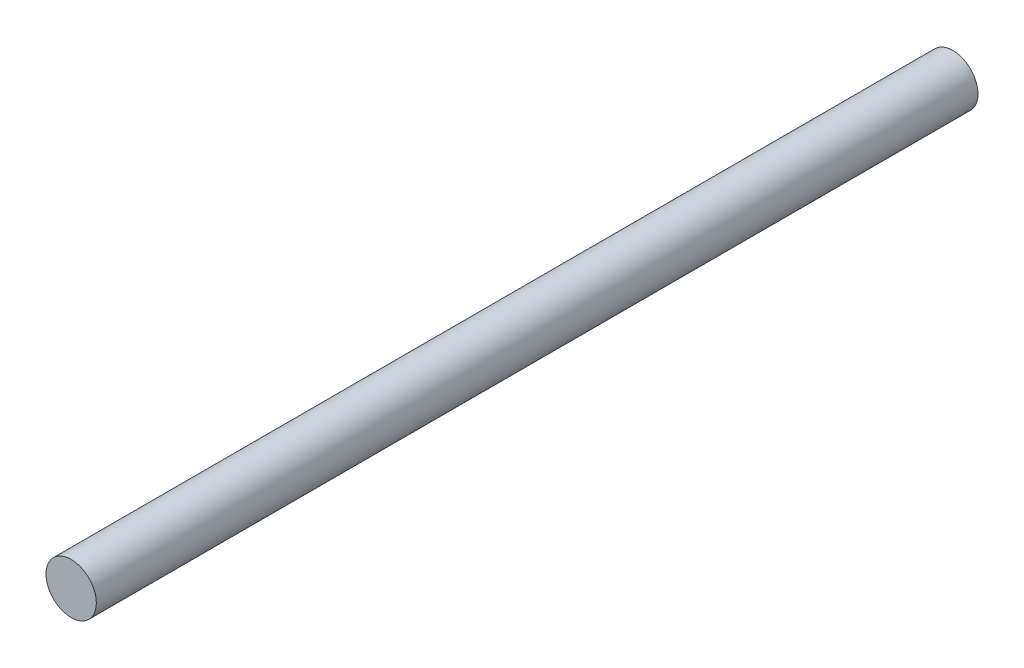
ISO-10303-21;
HEADER;
FILE_DESCRIPTION(('STEP AP214'),'2;1');
FILE_NAME('part.step','',(''),(''),'','','');
FILE_SCHEMA(('AUTOMOTIVE_DESIGN { 1 0 10303 214 1 1 1 1 }'));
ENDSEC;
DATA;
#1=APPLICATION_CONTEXT('core data for automotive mechanical design processes');
#2=APPLICATION_PROTOCOL_DEFINITION('international standard','automotive_design',2000,#1);
#3=PRODUCT_CONTEXT('',#1,'mechanical');
#4=PRODUCT('Part','Part','',(#3));
#5=PRODUCT_RELATED_PRODUCT_CATEGORY('part','',(#4));
#6=PRODUCT_DEFINITION_FORMATION('','',#4);
#7=PRODUCT_DEFINITION_CONTEXT('part definition',#1,'design');
#8=PRODUCT_DEFINITION('design','',#6,#7);
#9=PRODUCT_DEFINITION_SHAPE('','',#8);
#10=(LENGTH_UNIT() NAMED_UNIT(*) SI_UNIT(.MILLI.,.METRE.));
#11=(NAMED_UNIT(*) PLANE_ANGLE_UNIT() SI_UNIT($,.RADIAN.));
#12=(NAMED_UNIT(*) SI_UNIT($,.STERADIAN.) SOLID_ANGLE_UNIT());
#13=UNCERTAINTY_MEASURE_WITH_UNIT(LENGTH_MEASURE(1.E-05),#10,'distance_accuracy_value','');
#14=(GEOMETRIC_REPRESENTATION_CONTEXT(3) GLOBAL_UNCERTAINTY_ASSIGNED_CONTEXT((#13)) GLOBAL_UNIT_ASSIGNED_CONTEXT((#10,
#11,#12)) REPRESENTATION_CONTEXT('',''));
#15=CARTESIAN_POINT('',(0.,0.,0.));
#16=DIRECTION('',(0.,0.,1.));
#17=DIRECTION('',(1.,0.,0.));
#18=AXIS2_PLACEMENT_3D('',#15,#16,#17);
#19=CARTESIAN_POINT('',(0.,0.,140.));
#20=DIRECTION('',(0.,0.,-1.));
#21=DIRECTION('',(-1.,0.,0.));
#22=AXIS2_PLACEMENT_3D('',#19,#20,#21);
#23=CYLINDRICAL_SURFACE('',#22,4.);
#24=CARTESIAN_POINT('',(0.,0.,140.));
#25=DIRECTION('',(0.,0.,1.));
#26=DIRECTION('',(1.,0.,0.));
#27=AXIS2_PLACEMENT_3D('',#24,#25,#26);
#28=CIRCLE('',#27,4.);
#29=CARTESIAN_POINT('',(4.,0.,140.));
#30=VERTEX_POINT('',#29);
#31=EDGE_CURVE('E10',#30,#30,#28,.T.);
#32=ORIENTED_EDGE('',*,*,#31,.F.);
#33=EDGE_LOOP('',(#32));
#34=FACE_BOUND('',#33,.T.);
#35=CARTESIAN_POINT('',(0.,0.,0.));
#36=DIRECTION('',(0.,0.,1.));
#37=DIRECTION('',(1.,0.,0.));
#38=AXIS2_PLACEMENT_3D('',#35,#36,#37);
#39=CIRCLE('',#38,4.);
#40=CARTESIAN_POINT('',(4.,0.,0.));
#41=VERTEX_POINT('',#40);
#42=EDGE_CURVE('E34',#41,#41,#39,.T.);
#43=ORIENTED_EDGE('',*,*,#42,.T.);
#44=EDGE_LOOP('',(#43));
#45=FACE_BOUND('',#44,.T.);
#46=ADVANCED_FACE('F31',(#34,#45),#23,.T.);
#47=CARTESIAN_POINT('',(0.,0.,140.));
#48=DIRECTION('',(0.,0.,1.));
#49=DIRECTION('',(1.,0.,0.));
#50=AXIS2_PLACEMENT_3D('',#47,#48,#49);
#51=PLANE('',#50);
#52=ORIENTED_EDGE('',*,*,#31,.T.);
#53=EDGE_LOOP('',(#52));
#54=FACE_BOUND('',#53,.T.);
#55=ADVANCED_FACE('F46',(#54),#51,.T.);
#56=CARTESIAN_POINT('',(0.,0.,0.));
#57=DIRECTION('',(0.,0.,1.));
#58=DIRECTION('',(1.,0.,0.));
#59=AXIS2_PLACEMENT_3D('',#56,#57,#58);
#60=PLANE('',#59);
#61=ORIENTED_EDGE('',*,*,#42,.F.);
#62=EDGE_LOOP('',(#61));
#63=FACE_BOUND('',#62,.T.);
#64=ADVANCED_FACE('F44',(#63),#60,.F.);
#65=CLOSED_SHELL('',(#46,#55,#64));
#66=MANIFOLD_SOLID_BREP('B2',#65);
#67=ADVANCED_BREP_SHAPE_REPRESENTATION('',(#18,#66),#14);
#68=SHAPE_DEFINITION_REPRESENTATION(#9,#67);
ENDSEC;
END-ISO-10303-21;
